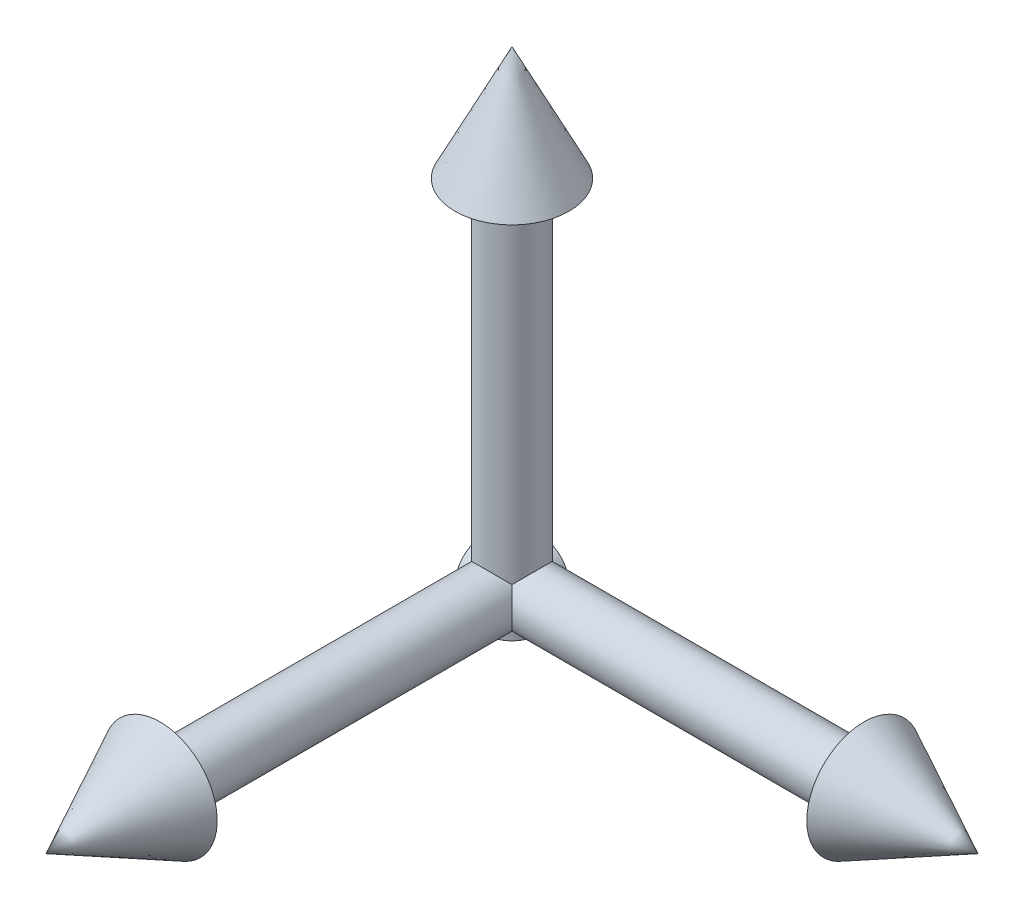
ISO-10303-21;
HEADER;
FILE_DESCRIPTION(('STEP AP214'),'2;1');
FILE_NAME('part.step','',(''),(''),'','','');
FILE_SCHEMA(('AUTOMOTIVE_DESIGN { 1 0 10303 214 1 1 1 1 }'));
ENDSEC;
DATA;
#1=APPLICATION_CONTEXT('core data for automotive mechanical design processes');
#2=APPLICATION_PROTOCOL_DEFINITION('international standard','automotive_design',2000,#1);
#3=PRODUCT_CONTEXT('',#1,'mechanical');
#4=PRODUCT('Part','Part','',(#3));
#5=PRODUCT_RELATED_PRODUCT_CATEGORY('part','',(#4));
#6=PRODUCT_DEFINITION_FORMATION('','',#4);
#7=PRODUCT_DEFINITION_CONTEXT('part definition',#1,'design');
#8=PRODUCT_DEFINITION('design','',#6,#7);
#9=PRODUCT_DEFINITION_SHAPE('','',#8);
#10=(LENGTH_UNIT() NAMED_UNIT(*) SI_UNIT(.MILLI.,.METRE.));
#11=(NAMED_UNIT(*) PLANE_ANGLE_UNIT() SI_UNIT($,.RADIAN.));
#12=(NAMED_UNIT(*) SI_UNIT($,.STERADIAN.) SOLID_ANGLE_UNIT());
#13=UNCERTAINTY_MEASURE_WITH_UNIT(LENGTH_MEASURE(1.E-05),#10,'distance_accuracy_value','');
#14=(GEOMETRIC_REPRESENTATION_CONTEXT(3) GLOBAL_UNCERTAINTY_ASSIGNED_CONTEXT((#13)) GLOBAL_UNIT_ASSIGNED_CONTEXT((#10,
#11,#12)) REPRESENTATION_CONTEXT('',''));
#15=CARTESIAN_POINT('',(0.,0.,0.));
#16=DIRECTION('',(0.,0.,1.));
#17=DIRECTION('',(1.,0.,0.));
#18=AXIS2_PLACEMENT_3D('',#15,#16,#17);
#19=CARTESIAN_POINT('',(-2.77555756156289E-13,100.,0.));
#20=DIRECTION('',(0.,-1.,0.));
#21=DIRECTION('',(0.661092000432145,0.,0.750304849354331));
#22=AXIS2_PLACEMENT_3D('',#19,#20,#21);
#23=CYLINDRICAL_SURFACE('',#22,7.5);
#24=CARTESIAN_POINT('',(-2.77555756156289E-13,100.,0.));
#25=DIRECTION('',(0.,1.,0.));
#26=DIRECTION('',(-0.661092000432145,0.,-0.750304849354331));
#27=AXIS2_PLACEMENT_3D('',#24,#25,#26);
#28=CIRCLE('',#27,7.5);
#29=CARTESIAN_POINT('',(-4.95819000324136,100.,-5.62728637015743));
#30=VERTEX_POINT('',#29);
#31=EDGE_CURVE('E12',#30,#30,#28,.T.);
#32=ORIENTED_EDGE('',*,*,#31,.F.);
#33=EDGE_LOOP('',(#32));
#34=FACE_BOUND('',#33,.T.);
#35=CARTESIAN_POINT('',(0.,0.,0.));
#36=DIRECTION('',(0.,1.,0.));
#37=DIRECTION('',(-0.661092000432145,0.,-0.750304849354331));
#38=AXIS2_PLACEMENT_3D('',#35,#36,#37);
#39=CIRCLE('',#38,7.5);
#40=CARTESIAN_POINT('',(-4.958190003241,0.,-5.62728637015753));
#41=VERTEX_POINT('',#40);
#42=EDGE_CURVE('E46',#41,#41,#39,.T.);
#43=ORIENTED_EDGE('',*,*,#42,.T.);
#44=EDGE_LOOP('',(#43));
#45=FACE_BOUND('',#44,.T.);
#46=ADVANCED_FACE('F43',(#34,#45),#23,.T.);
#47=CARTESIAN_POINT('',(0.,0.,0.));
#48=DIRECTION('',(0.,1.,0.));
#49=DIRECTION('',(-0.661092000432145,0.,-0.750304849354331));
#50=AXIS2_PLACEMENT_3D('',#47,#48,#49);
#51=PLANE('',#50);
#52=ORIENTED_EDGE('',*,*,#42,.F.);
#53=EDGE_LOOP('',(#52));
#54=FACE_BOUND('',#53,.T.);
#55=ADVANCED_FACE('F60',(#54),#51,.F.);
#56=CARTESIAN_POINT('',(-2.75821032680312E-13,100.,0.));
#57=DIRECTION('',(0.,-1.,0.));
#58=DIRECTION('',(0.661092000432145,0.,0.750304849354331));
#59=AXIS2_PLACEMENT_3D('',#56,#57,#58);
#60=PLANE('',#59);
#61=ORIENTED_EDGE('',*,*,#31,.T.);
#62=EDGE_LOOP('',(#61));
#63=FACE_BOUND('',#62,.T.);
#64=CARTESIAN_POINT('',(-2.75821032680312E-13,100.,0.));
#65=DIRECTION('',(0.,1.,0.));
#66=DIRECTION('',(-0.661092000432145,0.,-0.750304849354331));
#67=AXIS2_PLACEMENT_3D('',#64,#65,#66);
#68=CIRCLE('',#67,15.);
#69=CARTESIAN_POINT('',(-9.91638000648244,99.9999999999999,-11.2545727403149));
#70=VERTEX_POINT('',#69);
#71=EDGE_CURVE('E74',#70,#70,#68,.T.);
#72=ORIENTED_EDGE('',*,*,#71,.F.);
#73=EDGE_LOOP('',(#72));
#74=FACE_BOUND('',#73,.T.);
#75=ADVANCED_FACE('F54',(#63,#74),#60,.T.);
#76=CARTESIAN_POINT('',(-3.86843335142828E-13,130.,0.));
#77=DIRECTION('',(0.,-1.,0.));
#78=DIRECTION('',(0.661092000432145,0.,0.750304849354331));
#79=AXIS2_PLACEMENT_3D('',#76,#77,#78);
#80=CONICAL_SURFACE('',#79,0.,0.463647609000806);
#81=ORIENTED_EDGE('',*,*,#71,.T.);
#82=EDGE_LOOP('',(#81));
#83=FACE_BOUND('',#82,.T.);
#84=CARTESIAN_POINT('',(-3.86843335142828E-13,130.,0.));
#85=VERTEX_POINT('',#84);
#86=VERTEX_LOOP('',#85);
#87=FACE_BOUND('',#86,.T.);
#88=ADVANCED_FACE('F52',(#83,#87),#80,.T.);
#89=CLOSED_SHELL('',(#46,#55,#75,#88));
#90=MANIFOLD_SOLID_BREP('B2',#89);
#91=CARTESIAN_POINT('',(92.5000000000001,7.50000000000029,-3.38742450602013E-13));
#92=DIRECTION('',(-1.,0.,0.));
#93=DIRECTION('',(0.,-0.999999581266916,0.000915131680972299));
#94=AXIS2_PLACEMENT_3D('',#91,#92,#93);
#95=CYLINDRICAL_SURFACE('',#94,7.5);
#96=CARTESIAN_POINT('',(92.5000000000001,7.50000000000029,-3.38742450602013E-13));
#97=DIRECTION('',(1.,0.,0.));
#98=DIRECTION('',(0.,0.999999581266916,-0.000915131680972299));
#99=AXIS2_PLACEMENT_3D('',#96,#97,#98);
#100=CIRCLE('',#99,7.5);
#101=CARTESIAN_POINT('',(92.5,14.9999968595022,-0.00686348760763098));
#102=VERTEX_POINT('',#101);
#103=EDGE_CURVE('E41',#102,#102,#100,.T.);
#104=ORIENTED_EDGE('',*,*,#103,.F.);
#105=EDGE_LOOP('',(#104));
#106=FACE_BOUND('',#105,.T.);
#107=CARTESIAN_POINT('',(-7.49999999999996,7.49999999999994,0.));
#108=DIRECTION('',(1.,0.,0.));
#109=DIRECTION('',(0.,0.999999581266916,-0.000915131680972299));
#110=AXIS2_PLACEMENT_3D('',#107,#108,#109);
#111=CIRCLE('',#110,7.5);
#112=CARTESIAN_POINT('',(-7.49999999999998,14.9999968595018,-0.00686348760728183));
#113=VERTEX_POINT('',#112);
#114=EDGE_CURVE('E112',#113,#113,#111,.T.);
#115=ORIENTED_EDGE('',*,*,#114,.T.);
#116=EDGE_LOOP('',(#115));
#117=FACE_BOUND('',#116,.T.);
#118=ADVANCED_FACE('F109',(#106,#117),#95,.T.);
#119=CARTESIAN_POINT('',(-7.49999999999996,7.49999999999994,0.));
#120=DIRECTION('',(1.,0.,0.));
#121=DIRECTION('',(0.,0.999999581266916,-0.000915131680972299));
#122=AXIS2_PLACEMENT_3D('',#119,#120,#121);
#123=PLANE('',#122);
#124=ORIENTED_EDGE('',*,*,#114,.F.);
#125=EDGE_LOOP('',(#124));
#126=FACE_BOUND('',#125,.T.);
#127=ADVANCED_FACE('F126',(#126),#123,.F.);
#128=CARTESIAN_POINT('',(92.5000000000001,7.50000000000029,-3.387404662265E-13));
#129=DIRECTION('',(-1.,0.,0.));
#130=DIRECTION('',(0.,-0.999999581266916,0.000915131680972299));
#131=AXIS2_PLACEMENT_3D('',#128,#129,#130);
#132=PLANE('',#131);
#133=ORIENTED_EDGE('',*,*,#103,.T.);
#134=EDGE_LOOP('',(#133));
#135=FACE_BOUND('',#134,.T.);
#136=CARTESIAN_POINT('',(92.5000000000001,7.50000000000029,-3.387404662265E-13));
#137=DIRECTION('',(1.,0.,0.));
#138=DIRECTION('',(0.,0.999999581266916,-0.000915131680972299));
#139=AXIS2_PLACEMENT_3D('',#136,#137,#138);
#140=CIRCLE('',#139,15.);
#141=CARTESIAN_POINT('',(92.5,22.499993719004,-0.0137269752149232));
#142=VERTEX_POINT('',#141);
#143=EDGE_CURVE('E140',#142,#142,#140,.T.);
#144=ORIENTED_EDGE('',*,*,#143,.F.);
#145=EDGE_LOOP('',(#144));
#146=FACE_BOUND('',#145,.T.);
#147=ADVANCED_FACE('F120',(#135,#146),#132,.T.);
#148=CARTESIAN_POINT('',(122.5,7.5000000000004,-4.43488248395917E-13));
#149=DIRECTION('',(-1.,0.,0.));
#150=DIRECTION('',(0.,-0.999999581266916,0.000915131680972299));
#151=AXIS2_PLACEMENT_3D('',#148,#149,#150);
#152=CONICAL_SURFACE('',#151,0.,0.463647609000806);
#153=ORIENTED_EDGE('',*,*,#143,.T.);
#154=EDGE_LOOP('',(#153));
#155=FACE_BOUND('',#154,.T.);
#156=CARTESIAN_POINT('',(122.5,7.5000000000004,-4.43488248395917E-13));
#157=VERTEX_POINT('',#156);
#158=VERTEX_LOOP('',#157);
#159=FACE_BOUND('',#158,.T.);
#160=ADVANCED_FACE('F118',(#155,#159),#152,.T.);
#161=CLOSED_SHELL('',(#118,#127,#147,#160));
#162=MANIFOLD_SOLID_BREP('B6',#161);
#163=CARTESIAN_POINT('',(3.63424568217141E-13,7.49999999999986,92.5000000000001));
#164=DIRECTION('',(0.,0.,-1.));
#165=DIRECTION('',(-0.28501225807276,-0.958523871767556,0.));
#166=AXIS2_PLACEMENT_3D('',#163,#164,#165);
#167=CYLINDRICAL_SURFACE('',#166,7.5);
#168=CARTESIAN_POINT('',(3.63424568217141E-13,7.49999999999986,92.5000000000001));
#169=DIRECTION('',(0.,0.,1.));
#170=DIRECTION('',(0.28501225807276,0.958523871767556,0.));
#171=AXIS2_PLACEMENT_3D('',#168,#169,#170);
#172=CIRCLE('',#171,7.5);
#173=CARTESIAN_POINT('',(2.13759193554606,14.6889290382565,92.5));
#174=VERTEX_POINT('',#173);
#175=EDGE_CURVE('E107',#174,#174,#172,.T.);
#176=ORIENTED_EDGE('',*,*,#175,.F.);
#177=EDGE_LOOP('',(#176));
#178=FACE_BOUND('',#177,.T.);
#179=CARTESIAN_POINT('',(0.,7.49999999999987,-7.49999999999995));
#180=DIRECTION('',(0.,0.,1.));
#181=DIRECTION('',(0.28501225807276,0.958523871767556,0.));
#182=AXIS2_PLACEMENT_3D('',#179,#180,#181);
#183=CIRCLE('',#182,7.5);
#184=CARTESIAN_POINT('',(2.13759193554564,14.6889290382565,-7.49999999999996));
#185=VERTEX_POINT('',#184);
#186=EDGE_CURVE('E169',#185,#185,#183,.T.);
#187=ORIENTED_EDGE('',*,*,#186,.T.);
#188=EDGE_LOOP('',(#187));
#189=FACE_BOUND('',#188,.T.);
#190=ADVANCED_FACE('F166',(#178,#189),#167,.T.);
#191=CARTESIAN_POINT('',(0.,7.49999999999987,-7.49999999999995));
#192=DIRECTION('',(0.,0.,1.));
#193=DIRECTION('',(0.28501225807276,0.958523871767556,0.));
#194=AXIS2_PLACEMENT_3D('',#191,#192,#193);
#195=PLANE('',#194);
#196=ORIENTED_EDGE('',*,*,#186,.F.);
#197=EDGE_LOOP('',(#196));
#198=FACE_BOUND('',#197,.T.);
#199=ADVANCED_FACE('F183',(#198),#195,.F.);
#200=CARTESIAN_POINT('',(3.63424568217141E-13,7.49999999999986,92.5000000000001));
#201=DIRECTION('',(0.,0.,-1.));
#202=DIRECTION('',(-0.28501225807276,-0.958523871767556,0.));
#203=AXIS2_PLACEMENT_3D('',#200,#201,#202);
#204=PLANE('',#203);
#205=ORIENTED_EDGE('',*,*,#175,.T.);
#206=EDGE_LOOP('',(#205));
#207=FACE_BOUND('',#206,.T.);
#208=CARTESIAN_POINT('',(3.63424568217141E-13,7.49999999999986,92.5000000000001));
#209=DIRECTION('',(0.,0.,1.));
#210=DIRECTION('',(0.28501225807276,0.958523871767556,0.));
#211=AXIS2_PLACEMENT_3D('',#208,#209,#210);
#212=CIRCLE('',#211,15.);
#213=CARTESIAN_POINT('',(4.27518387109176,21.8778580765132,92.5));
#214=VERTEX_POINT('',#213);
#215=EDGE_CURVE('E197',#214,#214,#212,.T.);
#216=ORIENTED_EDGE('',*,*,#215,.F.);
#217=EDGE_LOOP('',(#216));
#218=FACE_BOUND('',#217,.T.);
#219=ADVANCED_FACE('F177',(#207,#218),#204,.T.);
#220=CARTESIAN_POINT('',(4.91794105439425E-13,7.49999999999986,122.5));
#221=DIRECTION('',(0.,0.,-1.));
#222=DIRECTION('',(-0.28501225807276,-0.958523871767556,0.));
#223=AXIS2_PLACEMENT_3D('',#220,#221,#222);
#224=CONICAL_SURFACE('',#223,0.,0.463647609000806);
#225=ORIENTED_EDGE('',*,*,#215,.T.);
#226=EDGE_LOOP('',(#225));
#227=FACE_BOUND('',#226,.T.);
#228=CARTESIAN_POINT('',(4.91794105439425E-13,7.49999999999986,122.5));
#229=VERTEX_POINT('',#228);
#230=VERTEX_LOOP('',#229);
#231=FACE_BOUND('',#230,.T.);
#232=ADVANCED_FACE('F175',(#227,#231),#224,.T.);
#233=CLOSED_SHELL('',(#190,#199,#219,#232));
#234=MANIFOLD_SOLID_BREP('B35',#233);
#235=ADVANCED_BREP_SHAPE_REPRESENTATION('',(#18,#90,#162,#234),#14);
#236=SHAPE_DEFINITION_REPRESENTATION(#9,#235);
ENDSEC;
END-ISO-10303-21;
